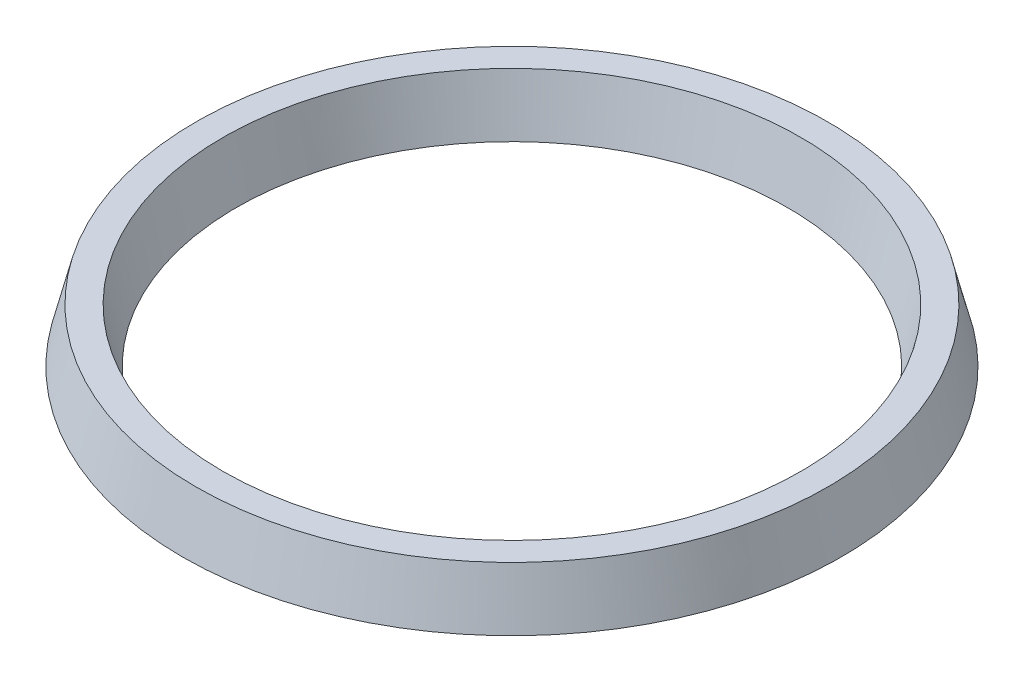
ISO-10303-21;
HEADER;
FILE_DESCRIPTION(('STEP AP214'),'2;1');
FILE_NAME('part.step','',(''),(''),'','','');
FILE_SCHEMA(('AUTOMOTIVE_DESIGN { 1 0 10303 214 1 1 1 1 }'));
ENDSEC;
DATA;
#1=APPLICATION_CONTEXT('core data for automotive mechanical design processes');
#2=APPLICATION_PROTOCOL_DEFINITION('international standard','automotive_design',2000,#1);
#3=PRODUCT_CONTEXT('',#1,'mechanical');
#4=PRODUCT('Part','Part','',(#3));
#5=PRODUCT_RELATED_PRODUCT_CATEGORY('part','',(#4));
#6=PRODUCT_DEFINITION_FORMATION('','',#4);
#7=PRODUCT_DEFINITION_CONTEXT('part definition',#1,'design');
#8=PRODUCT_DEFINITION('design','',#6,#7);
#9=PRODUCT_DEFINITION_SHAPE('','',#8);
#10=(LENGTH_UNIT() NAMED_UNIT(*) SI_UNIT(.MILLI.,.METRE.));
#11=(NAMED_UNIT(*) PLANE_ANGLE_UNIT() SI_UNIT($,.RADIAN.));
#12=(NAMED_UNIT(*) SI_UNIT($,.STERADIAN.) SOLID_ANGLE_UNIT());
#13=UNCERTAINTY_MEASURE_WITH_UNIT(LENGTH_MEASURE(1.E-05),#10,'distance_accuracy_value','');
#14=(GEOMETRIC_REPRESENTATION_CONTEXT(3) GLOBAL_UNCERTAINTY_ASSIGNED_CONTEXT((#13)) GLOBAL_UNIT_ASSIGNED_CONTEXT((#10,
#11,#12)) REPRESENTATION_CONTEXT('',''));
#15=CARTESIAN_POINT('',(0.,0.,0.));
#16=DIRECTION('',(0.,0.,1.));
#17=DIRECTION('',(1.,0.,0.));
#18=AXIS2_PLACEMENT_3D('',#15,#16,#17);
#19=CARTESIAN_POINT('',(0.,6.,0.));
#20=DIRECTION('',(0.,1.,0.));
#21=DIRECTION('',(0.,0.,1.));
#22=AXIS2_PLACEMENT_3D('',#19,#20,#21);
#23=CONICAL_SURFACE('',#22,64.31,0.244978663126864);
#24=CARTESIAN_POINT('',(0.,-6.,0.));
#25=DIRECTION('',(0.,1.,0.));
#26=DIRECTION('',(0.,0.,1.));
#27=AXIS2_PLACEMENT_3D('',#24,#25,#26);
#28=CIRCLE('',#27,61.31);
#29=CARTESIAN_POINT('',(0.,-6.,61.31));
#30=VERTEX_POINT('',#29);
#31=EDGE_CURVE('E63',#30,#30,#28,.T.);
#32=ORIENTED_EDGE('',*,*,#31,.F.);
#33=EDGE_LOOP('',(#32));
#34=FACE_BOUND('',#33,.T.);
#35=CARTESIAN_POINT('',(0.,6.,0.));
#36=DIRECTION('',(0.,1.,0.));
#37=DIRECTION('',(0.,0.,1.));
#38=AXIS2_PLACEMENT_3D('',#35,#36,#37);
#39=CIRCLE('',#38,64.31);
#40=CARTESIAN_POINT('',(0.,6.,64.31));
#41=VERTEX_POINT('',#40);
#42=EDGE_CURVE('E10',#41,#41,#39,.T.);
#43=ORIENTED_EDGE('',*,*,#42,.T.);
#44=EDGE_LOOP('',(#43));
#45=FACE_BOUND('',#44,.T.);
#46=ADVANCED_FACE('F35',(#34,#45),#23,.F.);
#47=CARTESIAN_POINT('',(0.,6.,-64.31));
#48=DIRECTION('',(0.,-1.,0.));
#49=DIRECTION('',(0.,0.,-1.));
#50=AXIS2_PLACEMENT_3D('',#47,#48,#49);
#51=PLANE('',#50);
#52=ORIENTED_EDGE('',*,*,#42,.F.);
#53=EDGE_LOOP('',(#52));
#54=FACE_BOUND('',#53,.T.);
#55=CARTESIAN_POINT('',(0.,6.00000000000001,0.));
#56=DIRECTION('',(0.,1.,0.));
#57=DIRECTION('',(0.,0.,1.));
#58=AXIS2_PLACEMENT_3D('',#55,#56,#57);
#59=CIRCLE('',#58,70.31);
#60=CARTESIAN_POINT('',(0.,6.00000000000001,70.31));
#61=VERTEX_POINT('',#60);
#62=EDGE_CURVE('E41',#61,#61,#59,.T.);
#63=ORIENTED_EDGE('',*,*,#62,.T.);
#64=EDGE_LOOP('',(#63));
#65=FACE_BOUND('',#64,.T.);
#66=ADVANCED_FACE('F70',(#54,#65),#51,.F.);
#67=CARTESIAN_POINT('',(0.,-5.99999999999999,0.));
#68=DIRECTION('',(0.,-1.,0.));
#69=DIRECTION('',(0.,0.,-1.));
#70=AXIS2_PLACEMENT_3D('',#67,#68,#69);
#71=CONICAL_SURFACE('',#70,73.31,0.244978663126864);
#72=ORIENTED_EDGE('',*,*,#62,.F.);
#73=EDGE_LOOP('',(#72));
#74=FACE_BOUND('',#73,.T.);
#75=CARTESIAN_POINT('',(0.,-5.99999999999999,0.));
#76=DIRECTION('',(0.,1.,0.));
#77=DIRECTION('',(0.,0.,1.));
#78=AXIS2_PLACEMENT_3D('',#75,#76,#77);
#79=CIRCLE('',#78,73.31);
#80=CARTESIAN_POINT('',(0.,-5.99999999999999,73.31));
#81=VERTEX_POINT('',#80);
#82=EDGE_CURVE('E45',#81,#81,#79,.T.);
#83=ORIENTED_EDGE('',*,*,#82,.T.);
#84=EDGE_LOOP('',(#83));
#85=FACE_BOUND('',#84,.T.);
#86=ADVANCED_FACE('F74',(#74,#85),#71,.T.);
#87=CARTESIAN_POINT('',(0.,-5.99999999999999,-73.31));
#88=DIRECTION('',(0.,1.,0.));
#89=DIRECTION('',(0.,0.,1.));
#90=AXIS2_PLACEMENT_3D('',#87,#88,#89);
#91=PLANE('',#90);
#92=ORIENTED_EDGE('',*,*,#82,.F.);
#93=EDGE_LOOP('',(#92));
#94=FACE_BOUND('',#93,.T.);
#95=CARTESIAN_POINT('',(0.,-6.,0.));
#96=DIRECTION('',(0.,1.,0.));
#97=DIRECTION('',(0.,0.,1.));
#98=AXIS2_PLACEMENT_3D('',#95,#96,#97);
#99=CIRCLE('',#98,70.31);
#100=CARTESIAN_POINT('',(0.,-6.,70.31));
#101=VERTEX_POINT('',#100);
#102=EDGE_CURVE('E49',#101,#101,#99,.T.);
#103=ORIENTED_EDGE('',*,*,#102,.T.);
#104=EDGE_LOOP('',(#103));
#105=FACE_BOUND('',#104,.T.);
#106=ADVANCED_FACE('F79',(#94,#105),#91,.F.);
#107=CARTESIAN_POINT('',(0.,-1.45521375021799,0.));
#108=DIRECTION('',(0.,-1.,0.));
#109=DIRECTION('',(0.,0.,-1.));
#110=AXIS2_PLACEMENT_3D('',#107,#108,#109);
#111=CONICAL_SURFACE('',#110,69.1738034375545,0.244978663126867);
#112=ORIENTED_EDGE('',*,*,#102,.F.);
#113=EDGE_LOOP('',(#112));
#114=FACE_BOUND('',#113,.T.);
#115=CARTESIAN_POINT('',(0.,-1.45521375021799,0.));
#116=DIRECTION('',(0.,1.,0.));
#117=DIRECTION('',(0.,0.,1.));
#118=AXIS2_PLACEMENT_3D('',#115,#116,#117);
#119=CIRCLE('',#118,69.1738034375545);
#120=CARTESIAN_POINT('',(0.,-1.45521375021799,69.1738034375545));
#121=VERTEX_POINT('',#120);
#122=EDGE_CURVE('E54',#121,#121,#119,.T.);
#123=ORIENTED_EDGE('',*,*,#122,.T.);
#124=EDGE_LOOP('',(#123));
#125=FACE_BOUND('',#124,.T.);
#126=ADVANCED_FACE('F85',(#114,#125),#111,.F.);
#127=CARTESIAN_POINT('',(0.,-1.92116460960661,0.));
#128=DIRECTION('',(0.,1.,0.));
#129=DIRECTION('',(0.,0.,1.));
#130=AXIS2_PLACEMENT_3D('',#127,#128,#129);
#131=TOROIDAL_SURFACE('',#130,67.31,1.9211646096066);
#132=ORIENTED_EDGE('',*,*,#122,.F.);
#133=EDGE_LOOP('',(#132));
#134=FACE_BOUND('',#133,.T.);
#135=CARTESIAN_POINT('',(0.,-1.45521375021799,0.));
#136=DIRECTION('',(0.,1.,0.));
#137=DIRECTION('',(0.,0.,1.));
#138=AXIS2_PLACEMENT_3D('',#135,#136,#137);
#139=CIRCLE('',#138,65.4461965624455);
#140=CARTESIAN_POINT('',(0.,-1.45521375021799,65.4461965624455));
#141=VERTEX_POINT('',#140);
#142=EDGE_CURVE('E57',#141,#141,#139,.T.);
#143=ORIENTED_EDGE('',*,*,#142,.T.);
#144=EDGE_LOOP('',(#143));
#145=FACE_BOUND('',#144,.T.);
#146=ADVANCED_FACE('F89',(#134,#145),#131,.F.);
#147=CARTESIAN_POINT('',(0.,-6.,0.));
#148=DIRECTION('',(0.,1.,0.));
#149=DIRECTION('',(0.,0.,1.));
#150=AXIS2_PLACEMENT_3D('',#147,#148,#149);
#151=CONICAL_SURFACE('',#150,64.31,0.244978663126867);
#152=ORIENTED_EDGE('',*,*,#142,.F.);
#153=EDGE_LOOP('',(#152));
#154=FACE_BOUND('',#153,.T.);
#155=CARTESIAN_POINT('',(0.,-6.,0.));
#156=DIRECTION('',(0.,1.,0.));
#157=DIRECTION('',(0.,0.,1.));
#158=AXIS2_PLACEMENT_3D('',#155,#156,#157);
#159=CIRCLE('',#158,64.31);
#160=CARTESIAN_POINT('',(0.,-6.,64.31));
#161=VERTEX_POINT('',#160);
#162=EDGE_CURVE('E60',#161,#161,#159,.T.);
#163=ORIENTED_EDGE('',*,*,#162,.T.);
#164=EDGE_LOOP('',(#163));
#165=FACE_BOUND('',#164,.T.);
#166=ADVANCED_FACE('F93',(#154,#165),#151,.T.);
#167=CARTESIAN_POINT('',(0.,-6.,-61.31));
#168=DIRECTION('',(0.,1.,0.));
#169=DIRECTION('',(0.,0.,1.));
#170=AXIS2_PLACEMENT_3D('',#167,#168,#169);
#171=PLANE('',#170);
#172=ORIENTED_EDGE('',*,*,#162,.F.);
#173=EDGE_LOOP('',(#172));
#174=FACE_BOUND('',#173,.T.);
#175=ORIENTED_EDGE('',*,*,#31,.T.);
#176=EDGE_LOOP('',(#175));
#177=FACE_BOUND('',#176,.T.);
#178=ADVANCED_FACE('F67',(#174,#177),#171,.F.);
#179=CLOSED_SHELL('',(#46,#66,#86,#106,#126,#146,#166,#178));
#180=MANIFOLD_SOLID_BREP('B2',#179);
#181=ADVANCED_BREP_SHAPE_REPRESENTATION('',(#18,#180),#14);
#182=SHAPE_DEFINITION_REPRESENTATION(#9,#181);
ENDSEC;
END-ISO-10303-21;
